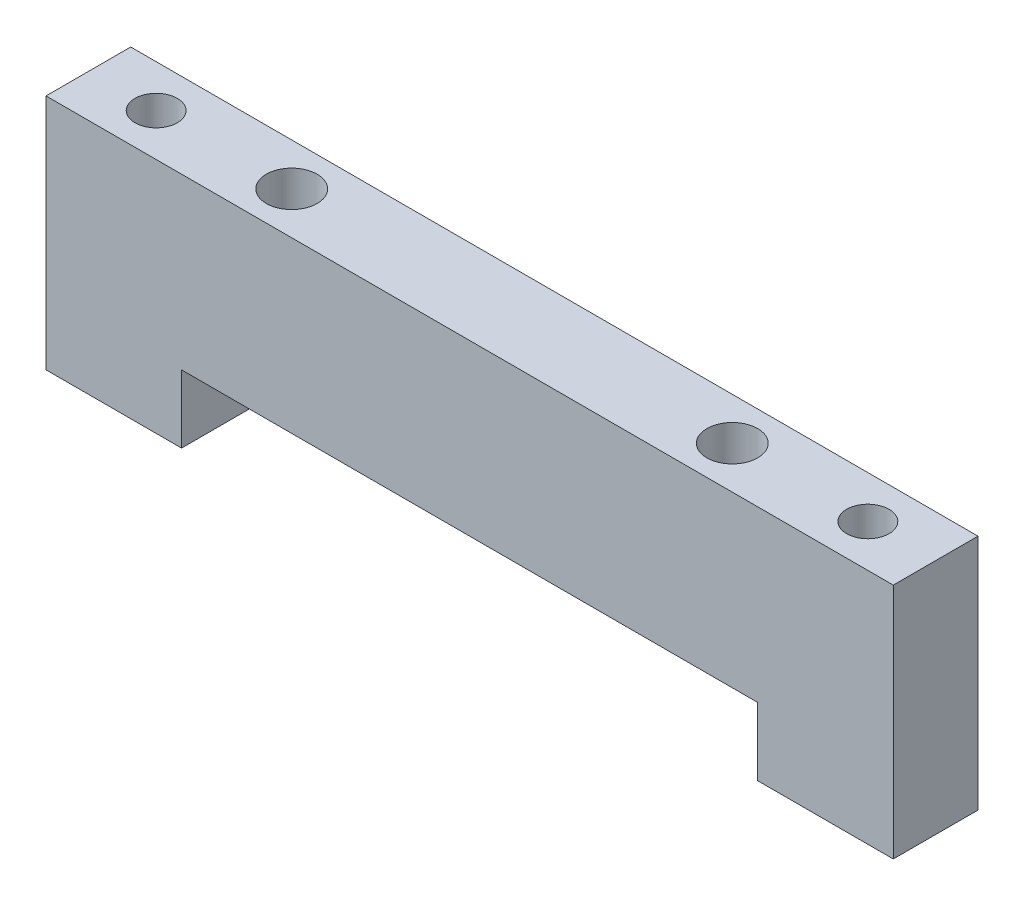
ISO-10303-21;
HEADER;
FILE_DESCRIPTION(('STEP AP214'),'2;1');
FILE_NAME('part.step','',(''),(''),'','','');
FILE_SCHEMA(('AUTOMOTIVE_DESIGN { 1 0 10303 214 1 1 1 1 }'));
ENDSEC;
DATA;
#1=APPLICATION_CONTEXT('core data for automotive mechanical design processes');
#2=APPLICATION_PROTOCOL_DEFINITION('international standard','automotive_design',2000,#1);
#3=PRODUCT_CONTEXT('',#1,'mechanical');
#4=PRODUCT('Part','Part','',(#3));
#5=PRODUCT_RELATED_PRODUCT_CATEGORY('part','',(#4));
#6=PRODUCT_DEFINITION_FORMATION('','',#4);
#7=PRODUCT_DEFINITION_CONTEXT('part definition',#1,'design');
#8=PRODUCT_DEFINITION('design','',#6,#7);
#9=PRODUCT_DEFINITION_SHAPE('','',#8);
#10=(LENGTH_UNIT() NAMED_UNIT(*) SI_UNIT(.MILLI.,.METRE.));
#11=(NAMED_UNIT(*) PLANE_ANGLE_UNIT() SI_UNIT($,.RADIAN.));
#12=(NAMED_UNIT(*) SI_UNIT($,.STERADIAN.) SOLID_ANGLE_UNIT());
#13=UNCERTAINTY_MEASURE_WITH_UNIT(LENGTH_MEASURE(1.E-05),#10,'distance_accuracy_value','');
#14=(GEOMETRIC_REPRESENTATION_CONTEXT(3) GLOBAL_UNCERTAINTY_ASSIGNED_CONTEXT((#13)) GLOBAL_UNIT_ASSIGNED_CONTEXT((#10,
#11,#12)) REPRESENTATION_CONTEXT('',''));
#15=CARTESIAN_POINT('',(0.,0.,0.));
#16=DIRECTION('',(0.,0.,1.));
#17=DIRECTION('',(1.,0.,0.));
#18=AXIS2_PLACEMENT_3D('',#15,#16,#17);
#19=CARTESIAN_POINT('',(-25.,14.,5.));
#20=DIRECTION('',(1.,0.,0.));
#21=DIRECTION('',(0.,1.,0.));
#22=AXIS2_PLACEMENT_3D('',#19,#20,#21);
#23=PLANE('',#22);
#24=DIRECTION('',(0.,-1.,0.));
#25=VECTOR('',#24,1.);
#26=CARTESIAN_POINT('',(-25.,14.,0.));
#27=LINE('',#26,#25);
#28=CARTESIAN_POINT('',(-25.,14.,0.));
#29=VERTEX_POINT('',#28);
#30=CARTESIAN_POINT('',(-25.,0.,0.));
#31=VERTEX_POINT('',#30);
#32=EDGE_CURVE('E130',#29,#31,#27,.T.);
#33=ORIENTED_EDGE('',*,*,#32,.T.);
#34=DIRECTION('',(0.,0.,-1.));
#35=VECTOR('',#34,1.);
#36=CARTESIAN_POINT('',(-25.,0.,5.));
#37=LINE('',#36,#35);
#38=CARTESIAN_POINT('',(-25.,0.,5.));
#39=VERTEX_POINT('',#38);
#40=EDGE_CURVE('E11',#39,#31,#37,.T.);
#41=ORIENTED_EDGE('',*,*,#40,.F.);
#42=DIRECTION('',(0.,-1.,0.));
#43=VECTOR('',#42,1.);
#44=CARTESIAN_POINT('',(-25.,14.,5.));
#45=LINE('',#44,#43);
#46=CARTESIAN_POINT('',(-25.,14.,5.));
#47=VERTEX_POINT('',#46);
#48=EDGE_CURVE('E145',#47,#39,#45,.T.);
#49=ORIENTED_EDGE('',*,*,#48,.F.);
#50=DIRECTION('',(0.,0.,-1.));
#51=VECTOR('',#50,1.);
#52=CARTESIAN_POINT('',(-25.,14.,5.));
#53=LINE('',#52,#51);
#54=EDGE_CURVE('E126',#47,#29,#53,.T.);
#55=ORIENTED_EDGE('',*,*,#54,.T.);
#56=EDGE_LOOP('',(#33,#41,#49,#55));
#57=FACE_BOUND('',#56,.T.);
#58=ADVANCED_FACE('F34',(#57),#23,.F.);
#59=CARTESIAN_POINT('',(-25.,0.,5.));
#60=DIRECTION('',(0.,1.,0.));
#61=DIRECTION('',(0.,0.,1.));
#62=AXIS2_PLACEMENT_3D('',#59,#60,#61);
#63=PLANE('',#62);
#64=CARTESIAN_POINT('',(-21.,0.,2.5));
#65=DIRECTION('',(0.,-1.,0.));
#66=DIRECTION('',(0.,0.,-1.));
#67=AXIS2_PLACEMENT_3D('',#64,#65,#66);
#68=CIRCLE('',#67,1.25);
#69=CARTESIAN_POINT('',(-21.,0.,1.25));
#70=VERTEX_POINT('',#69);
#71=EDGE_CURVE('E198',#70,#70,#68,.T.);
#72=ORIENTED_EDGE('',*,*,#71,.F.);
#73=EDGE_LOOP('',(#72));
#74=FACE_BOUND('',#73,.T.);
#75=DIRECTION('',(1.,0.,0.));
#76=VECTOR('',#75,1.);
#77=CARTESIAN_POINT('',(-25.,0.,0.));
#78=LINE('',#77,#76);
#79=CARTESIAN_POINT('',(-17.,0.,0.));
#80=VERTEX_POINT('',#79);
#81=EDGE_CURVE('E133',#31,#80,#78,.T.);
#82=ORIENTED_EDGE('',*,*,#81,.T.);
#83=DIRECTION('',(0.,0.,-1.));
#84=VECTOR('',#83,1.);
#85=CARTESIAN_POINT('',(-17.,0.,5.));
#86=LINE('',#85,#84);
#87=CARTESIAN_POINT('',(-17.,0.,5.));
#88=VERTEX_POINT('',#87);
#89=EDGE_CURVE('E42',#88,#80,#86,.T.);
#90=ORIENTED_EDGE('',*,*,#89,.F.);
#91=DIRECTION('',(1.,0.,0.));
#92=VECTOR('',#91,1.);
#93=CARTESIAN_POINT('',(-25.,0.,5.));
#94=LINE('',#93,#92);
#95=EDGE_CURVE('E93',#39,#88,#94,.T.);
#96=ORIENTED_EDGE('',*,*,#95,.F.);
#97=ORIENTED_EDGE('',*,*,#40,.T.);
#98=EDGE_LOOP('',(#82,#90,#96,#97));
#99=FACE_BOUND('',#98,.T.);
#100=ADVANCED_FACE('F204',(#74,#99),#63,.F.);
#101=CARTESIAN_POINT('',(-17.,0.,5.));
#102=DIRECTION('',(-1.,0.,0.));
#103=DIRECTION('',(0.,0.,1.));
#104=AXIS2_PLACEMENT_3D('',#101,#102,#103);
#105=PLANE('',#104);
#106=DIRECTION('',(0.,1.,0.));
#107=VECTOR('',#106,1.);
#108=CARTESIAN_POINT('',(-17.,0.,0.));
#109=LINE('',#108,#107);
#110=CARTESIAN_POINT('',(-17.,4.,0.));
#111=VERTEX_POINT('',#110);
#112=EDGE_CURVE('E136',#80,#111,#109,.T.);
#113=ORIENTED_EDGE('',*,*,#112,.T.);
#114=DIRECTION('',(0.,0.,-1.));
#115=VECTOR('',#114,1.);
#116=CARTESIAN_POINT('',(-17.,4.,5.));
#117=LINE('',#116,#115);
#118=CARTESIAN_POINT('',(-17.,4.,5.));
#119=VERTEX_POINT('',#118);
#120=EDGE_CURVE('E152',#119,#111,#117,.T.);
#121=ORIENTED_EDGE('',*,*,#120,.F.);
#122=DIRECTION('',(0.,1.,0.));
#123=VECTOR('',#122,1.);
#124=CARTESIAN_POINT('',(-17.,0.,5.));
#125=LINE('',#124,#123);
#126=EDGE_CURVE('E160',#88,#119,#125,.T.);
#127=ORIENTED_EDGE('',*,*,#126,.F.);
#128=ORIENTED_EDGE('',*,*,#89,.T.);
#129=EDGE_LOOP('',(#113,#121,#127,#128));
#130=FACE_BOUND('',#129,.T.);
#131=ADVANCED_FACE('F158',(#130),#105,.F.);
#132=CARTESIAN_POINT('',(-17.,4.,5.));
#133=DIRECTION('',(0.,1.,0.));
#134=DIRECTION('',(0.,0.,1.));
#135=AXIS2_PLACEMENT_3D('',#132,#133,#134);
#136=PLANE('',#135);
#137=CARTESIAN_POINT('',(-13.0000000000028,4.,2.50000000000003));
#138=DIRECTION('',(0.,1.,0.));
#139=DIRECTION('',(0.,0.,1.));
#140=AXIS2_PLACEMENT_3D('',#137,#138,#139);
#141=CIRCLE('',#140,1.50000000000264);
#142=CARTESIAN_POINT('',(-13.0000000000028,4.,4.00000000000267));
#143=VERTEX_POINT('',#142);
#144=EDGE_CURVE('E183',#143,#143,#141,.T.);
#145=ORIENTED_EDGE('',*,*,#144,.T.);
#146=EDGE_LOOP('',(#145));
#147=FACE_BOUND('',#146,.T.);
#148=CARTESIAN_POINT('',(12.9999999999973,4.,2.50000000000003));
#149=DIRECTION('',(0.,1.,0.));
#150=DIRECTION('',(0.,0.,1.));
#151=AXIS2_PLACEMENT_3D('',#148,#149,#150);
#152=CIRCLE('',#151,1.50000000000264);
#153=CARTESIAN_POINT('',(12.9999999999973,4.,4.00000000000267));
#154=VERTEX_POINT('',#153);
#155=EDGE_CURVE('E134',#154,#154,#152,.T.);
#156=ORIENTED_EDGE('',*,*,#155,.T.);
#157=EDGE_LOOP('',(#156));
#158=FACE_BOUND('',#157,.T.);
#159=DIRECTION('',(1.,0.,0.));
#160=VECTOR('',#159,1.);
#161=CARTESIAN_POINT('',(-17.,4.,0.));
#162=LINE('',#161,#160);
#163=CARTESIAN_POINT('',(17.,4.,0.));
#164=VERTEX_POINT('',#163);
#165=EDGE_CURVE('E138',#111,#164,#162,.T.);
#166=ORIENTED_EDGE('',*,*,#165,.T.);
#167=DIRECTION('',(0.,0.,-1.));
#168=VECTOR('',#167,1.);
#169=CARTESIAN_POINT('',(17.,4.,5.));
#170=LINE('',#169,#168);
#171=CARTESIAN_POINT('',(17.,4.,5.));
#172=VERTEX_POINT('',#171);
#173=EDGE_CURVE('E149',#172,#164,#170,.T.);
#174=ORIENTED_EDGE('',*,*,#173,.F.);
#175=DIRECTION('',(1.,0.,0.));
#176=VECTOR('',#175,1.);
#177=CARTESIAN_POINT('',(-17.,4.,5.));
#178=LINE('',#177,#176);
#179=EDGE_CURVE('E172',#119,#172,#178,.T.);
#180=ORIENTED_EDGE('',*,*,#179,.F.);
#181=ORIENTED_EDGE('',*,*,#120,.T.);
#182=EDGE_LOOP('',(#166,#174,#180,#181));
#183=FACE_BOUND('',#182,.T.);
#184=ADVANCED_FACE('F168',(#147,#158,#183),#136,.F.);
#185=CARTESIAN_POINT('',(17.,4.,5.));
#186=DIRECTION('',(1.,0.,0.));
#187=DIRECTION('',(0.,0.,-1.));
#188=AXIS2_PLACEMENT_3D('',#185,#186,#187);
#189=PLANE('',#188);
#190=DIRECTION('',(0.,-1.,0.));
#191=VECTOR('',#190,1.);
#192=CARTESIAN_POINT('',(17.,4.,0.));
#193=LINE('',#192,#191);
#194=CARTESIAN_POINT('',(17.,0.,0.));
#195=VERTEX_POINT('',#194);
#196=EDGE_CURVE('E140',#164,#195,#193,.T.);
#197=ORIENTED_EDGE('',*,*,#196,.T.);
#198=DIRECTION('',(0.,0.,-1.));
#199=VECTOR('',#198,1.);
#200=CARTESIAN_POINT('',(17.,0.,5.));
#201=LINE('',#200,#199);
#202=CARTESIAN_POINT('',(17.,0.,5.));
#203=VERTEX_POINT('',#202);
#204=EDGE_CURVE('E121',#203,#195,#201,.T.);
#205=ORIENTED_EDGE('',*,*,#204,.F.);
#206=DIRECTION('',(0.,-1.,0.));
#207=VECTOR('',#206,1.);
#208=CARTESIAN_POINT('',(17.,4.,5.));
#209=LINE('',#208,#207);
#210=EDGE_CURVE('E112',#172,#203,#209,.T.);
#211=ORIENTED_EDGE('',*,*,#210,.F.);
#212=ORIENTED_EDGE('',*,*,#173,.T.);
#213=EDGE_LOOP('',(#197,#205,#211,#212));
#214=FACE_BOUND('',#213,.T.);
#215=ADVANCED_FACE('F171',(#214),#189,.F.);
#216=CARTESIAN_POINT('',(17.,0.,5.));
#217=DIRECTION('',(0.,1.,0.));
#218=DIRECTION('',(0.,0.,1.));
#219=AXIS2_PLACEMENT_3D('',#216,#217,#218);
#220=PLANE('',#219);
#221=CARTESIAN_POINT('',(21.,0.,2.5));
#222=DIRECTION('',(0.,-1.,0.));
#223=DIRECTION('',(0.,0.,-1.));
#224=AXIS2_PLACEMENT_3D('',#221,#222,#223);
#225=CIRCLE('',#224,1.25);
#226=CARTESIAN_POINT('',(21.,0.,1.25));
#227=VERTEX_POINT('',#226);
#228=EDGE_CURVE('E192',#227,#227,#225,.T.);
#229=ORIENTED_EDGE('',*,*,#228,.F.);
#230=EDGE_LOOP('',(#229));
#231=FACE_BOUND('',#230,.T.);
#232=DIRECTION('',(1.,0.,0.));
#233=VECTOR('',#232,1.);
#234=CARTESIAN_POINT('',(17.,0.,0.));
#235=LINE('',#234,#233);
#236=CARTESIAN_POINT('',(25.,0.,0.));
#237=VERTEX_POINT('',#236);
#238=EDGE_CURVE('E120',#195,#237,#235,.T.);
#239=ORIENTED_EDGE('',*,*,#238,.T.);
#240=DIRECTION('',(0.,0.,-1.));
#241=VECTOR('',#240,1.);
#242=CARTESIAN_POINT('',(25.,0.,5.));
#243=LINE('',#242,#241);
#244=CARTESIAN_POINT('',(25.,0.,5.));
#245=VERTEX_POINT('',#244);
#246=EDGE_CURVE('E117',#245,#237,#243,.T.);
#247=ORIENTED_EDGE('',*,*,#246,.F.);
#248=DIRECTION('',(1.,0.,0.));
#249=VECTOR('',#248,1.);
#250=CARTESIAN_POINT('',(17.,0.,5.));
#251=LINE('',#250,#249);
#252=EDGE_CURVE('E106',#203,#245,#251,.T.);
#253=ORIENTED_EDGE('',*,*,#252,.F.);
#254=ORIENTED_EDGE('',*,*,#204,.T.);
#255=EDGE_LOOP('',(#239,#247,#253,#254));
#256=FACE_BOUND('',#255,.T.);
#257=ADVANCED_FACE('F118',(#231,#256),#220,.F.);
#258=CARTESIAN_POINT('',(25.,0.,5.));
#259=DIRECTION('',(-1.,0.,0.));
#260=DIRECTION('',(0.,-1.,0.));
#261=AXIS2_PLACEMENT_3D('',#258,#259,#260);
#262=PLANE('',#261);
#263=DIRECTION('',(0.,1.,0.));
#264=VECTOR('',#263,1.);
#265=CARTESIAN_POINT('',(25.,0.,0.));
#266=LINE('',#265,#264);
#267=CARTESIAN_POINT('',(25.,14.,0.));
#268=VERTEX_POINT('',#267);
#269=EDGE_CURVE('E79',#237,#268,#266,.T.);
#270=ORIENTED_EDGE('',*,*,#269,.T.);
#271=DIRECTION('',(0.,0.,-1.));
#272=VECTOR('',#271,1.);
#273=CARTESIAN_POINT('',(25.,14.,5.));
#274=LINE('',#273,#272);
#275=CARTESIAN_POINT('',(25.,14.,5.));
#276=VERTEX_POINT('',#275);
#277=EDGE_CURVE('E122',#276,#268,#274,.T.);
#278=ORIENTED_EDGE('',*,*,#277,.F.);
#279=DIRECTION('',(0.,1.,0.));
#280=VECTOR('',#279,1.);
#281=CARTESIAN_POINT('',(25.,0.,5.));
#282=LINE('',#281,#280);
#283=EDGE_CURVE('E110',#245,#276,#282,.T.);
#284=ORIENTED_EDGE('',*,*,#283,.F.);
#285=ORIENTED_EDGE('',*,*,#246,.T.);
#286=EDGE_LOOP('',(#270,#278,#284,#285));
#287=FACE_BOUND('',#286,.T.);
#288=ADVANCED_FACE('F124',(#287),#262,.F.);
#289=CARTESIAN_POINT('',(25.,14.,5.));
#290=DIRECTION('',(0.,-1.,0.));
#291=DIRECTION('',(0.,0.,-1.));
#292=AXIS2_PLACEMENT_3D('',#289,#290,#291);
#293=PLANE('',#292);
#294=CARTESIAN_POINT('',(-21.,14.,2.5));
#295=DIRECTION('',(0.,-1.,0.));
#296=DIRECTION('',(0.,0.,-1.));
#297=AXIS2_PLACEMENT_3D('',#294,#295,#296);
#298=CIRCLE('',#297,1.25);
#299=CARTESIAN_POINT('',(-21.,14.,1.25));
#300=VERTEX_POINT('',#299);
#301=EDGE_CURVE('E195',#300,#300,#298,.T.);
#302=ORIENTED_EDGE('',*,*,#301,.T.);
#303=EDGE_LOOP('',(#302));
#304=FACE_BOUND('',#303,.T.);
#305=CARTESIAN_POINT('',(21.,14.,2.5));
#306=DIRECTION('',(0.,-1.,0.));
#307=DIRECTION('',(0.,0.,-1.));
#308=AXIS2_PLACEMENT_3D('',#305,#306,#307);
#309=CIRCLE('',#308,1.25);
#310=CARTESIAN_POINT('',(21.,14.,1.25));
#311=VERTEX_POINT('',#310);
#312=EDGE_CURVE('E189',#311,#311,#309,.T.);
#313=ORIENTED_EDGE('',*,*,#312,.T.);
#314=EDGE_LOOP('',(#313));
#315=FACE_BOUND('',#314,.T.);
#316=CARTESIAN_POINT('',(-13.0000000000028,14.,2.50000000000003));
#317=DIRECTION('',(0.,1.,0.));
#318=DIRECTION('',(0.,0.,1.));
#319=AXIS2_PLACEMENT_3D('',#316,#317,#318);
#320=CIRCLE('',#319,1.50000000000264);
#321=CARTESIAN_POINT('',(-13.0000000000028,14.,4.00000000000267));
#322=VERTEX_POINT('',#321);
#323=EDGE_CURVE('E186',#322,#322,#320,.T.);
#324=ORIENTED_EDGE('',*,*,#323,.F.);
#325=EDGE_LOOP('',(#324));
#326=FACE_BOUND('',#325,.T.);
#327=CARTESIAN_POINT('',(12.9999999999973,14.,2.50000000000003));
#328=DIRECTION('',(0.,1.,0.));
#329=DIRECTION('',(0.,0.,1.));
#330=AXIS2_PLACEMENT_3D('',#327,#328,#329);
#331=CIRCLE('',#330,1.50000000000264);
#332=CARTESIAN_POINT('',(12.9999999999973,14.,4.00000000000267));
#333=VERTEX_POINT('',#332);
#334=EDGE_CURVE('E180',#333,#333,#331,.T.);
#335=ORIENTED_EDGE('',*,*,#334,.F.);
#336=EDGE_LOOP('',(#335));
#337=FACE_BOUND('',#336,.T.);
#338=DIRECTION('',(-1.,0.,0.));
#339=VECTOR('',#338,1.);
#340=CARTESIAN_POINT('',(25.,14.,0.));
#341=LINE('',#340,#339);
#342=EDGE_CURVE('E85',#268,#29,#341,.T.);
#343=ORIENTED_EDGE('',*,*,#342,.T.);
#344=ORIENTED_EDGE('',*,*,#54,.F.);
#345=DIRECTION('',(-1.,0.,0.));
#346=VECTOR('',#345,1.);
#347=CARTESIAN_POINT('',(25.,14.,5.));
#348=LINE('',#347,#346);
#349=EDGE_CURVE('E50',#276,#47,#348,.T.);
#350=ORIENTED_EDGE('',*,*,#349,.F.);
#351=ORIENTED_EDGE('',*,*,#277,.T.);
#352=EDGE_LOOP('',(#343,#344,#350,#351));
#353=FACE_BOUND('',#352,.T.);
#354=ADVANCED_FACE('F209',(#304,#315,#326,#337,#353),#293,.F.);
#355=CARTESIAN_POINT('',(-25.,0.,5.));
#356=DIRECTION('',(0.,0.,1.));
#357=DIRECTION('',(1.,0.,0.));
#358=AXIS2_PLACEMENT_3D('',#355,#356,#357);
#359=PLANE('',#358);
#360=ORIENTED_EDGE('',*,*,#48,.T.);
#361=ORIENTED_EDGE('',*,*,#95,.T.);
#362=ORIENTED_EDGE('',*,*,#126,.T.);
#363=ORIENTED_EDGE('',*,*,#179,.T.);
#364=ORIENTED_EDGE('',*,*,#210,.T.);
#365=ORIENTED_EDGE('',*,*,#252,.T.);
#366=ORIENTED_EDGE('',*,*,#283,.T.);
#367=ORIENTED_EDGE('',*,*,#349,.T.);
#368=EDGE_LOOP('',(#360,#361,#362,#363,#364,#365,#366,#367));
#369=FACE_BOUND('',#368,.T.);
#370=ADVANCED_FACE('F108',(#369),#359,.T.);
#371=CARTESIAN_POINT('',(-25.,0.,0.));
#372=DIRECTION('',(0.,0.,1.));
#373=DIRECTION('',(1.,0.,0.));
#374=AXIS2_PLACEMENT_3D('',#371,#372,#373);
#375=PLANE('',#374);
#376=ORIENTED_EDGE('',*,*,#32,.F.);
#377=ORIENTED_EDGE('',*,*,#342,.F.);
#378=ORIENTED_EDGE('',*,*,#269,.F.);
#379=ORIENTED_EDGE('',*,*,#238,.F.);
#380=ORIENTED_EDGE('',*,*,#196,.F.);
#381=ORIENTED_EDGE('',*,*,#165,.F.);
#382=ORIENTED_EDGE('',*,*,#112,.F.);
#383=ORIENTED_EDGE('',*,*,#81,.F.);
#384=EDGE_LOOP('',(#376,#377,#378,#379,#380,#381,#382,#383));
#385=FACE_BOUND('',#384,.T.);
#386=ADVANCED_FACE('F164',(#385),#375,.F.);
#387=CARTESIAN_POINT('',(12.9999999999973,0.,2.50000000000003));
#388=DIRECTION('',(0.,1.,0.));
#389=DIRECTION('',(0.,0.,1.));
#390=AXIS2_PLACEMENT_3D('',#387,#388,#389);
#391=CYLINDRICAL_SURFACE('',#390,1.50000000000264);
#392=ORIENTED_EDGE('',*,*,#334,.T.);
#393=EDGE_LOOP('',(#392));
#394=FACE_BOUND('',#393,.T.);
#395=ORIENTED_EDGE('',*,*,#155,.F.);
#396=EDGE_LOOP('',(#395));
#397=FACE_BOUND('',#396,.T.);
#398=ADVANCED_FACE('F275',(#394,#397),#391,.F.);
#399=CARTESIAN_POINT('',(-13.0000000000028,0.,2.50000000000003));
#400=DIRECTION('',(0.,1.,0.));
#401=DIRECTION('',(0.,0.,1.));
#402=AXIS2_PLACEMENT_3D('',#399,#400,#401);
#403=CYLINDRICAL_SURFACE('',#402,1.50000000000264);
#404=ORIENTED_EDGE('',*,*,#323,.T.);
#405=EDGE_LOOP('',(#404));
#406=FACE_BOUND('',#405,.T.);
#407=ORIENTED_EDGE('',*,*,#144,.F.);
#408=EDGE_LOOP('',(#407));
#409=FACE_BOUND('',#408,.T.);
#410=ADVANCED_FACE('F283',(#406,#409),#403,.F.);
#411=CARTESIAN_POINT('',(21.,0.,2.5));
#412=DIRECTION('',(0.,-1.,0.));
#413=DIRECTION('',(0.,0.,-1.));
#414=AXIS2_PLACEMENT_3D('',#411,#412,#413);
#415=CYLINDRICAL_SURFACE('',#414,1.25);
#416=ORIENTED_EDGE('',*,*,#312,.F.);
#417=EDGE_LOOP('',(#416));
#418=FACE_BOUND('',#417,.T.);
#419=ORIENTED_EDGE('',*,*,#228,.T.);
#420=EDGE_LOOP('',(#419));
#421=FACE_BOUND('',#420,.T.);
#422=ADVANCED_FACE('F289',(#418,#421),#415,.F.);
#423=CARTESIAN_POINT('',(-21.,0.,2.5));
#424=DIRECTION('',(0.,-1.,0.));
#425=DIRECTION('',(0.,0.,-1.));
#426=AXIS2_PLACEMENT_3D('',#423,#424,#425);
#427=CYLINDRICAL_SURFACE('',#426,1.25);
#428=ORIENTED_EDGE('',*,*,#301,.F.);
#429=EDGE_LOOP('',(#428));
#430=FACE_BOUND('',#429,.T.);
#431=ORIENTED_EDGE('',*,*,#71,.T.);
#432=EDGE_LOOP('',(#431));
#433=FACE_BOUND('',#432,.T.);
#434=ADVANCED_FACE('F202',(#430,#433),#427,.F.);
#435=CLOSED_SHELL('',(#58,#100,#131,#184,#215,#257,#288,#354,#370,#386,#398,#410,#422,#434));
#436=MANIFOLD_SOLID_BREP('B2',#435);
#437=ADVANCED_BREP_SHAPE_REPRESENTATION('',(#18,#436),#14);
#438=SHAPE_DEFINITION_REPRESENTATION(#9,#437);
ENDSEC;
END-ISO-10303-21;
